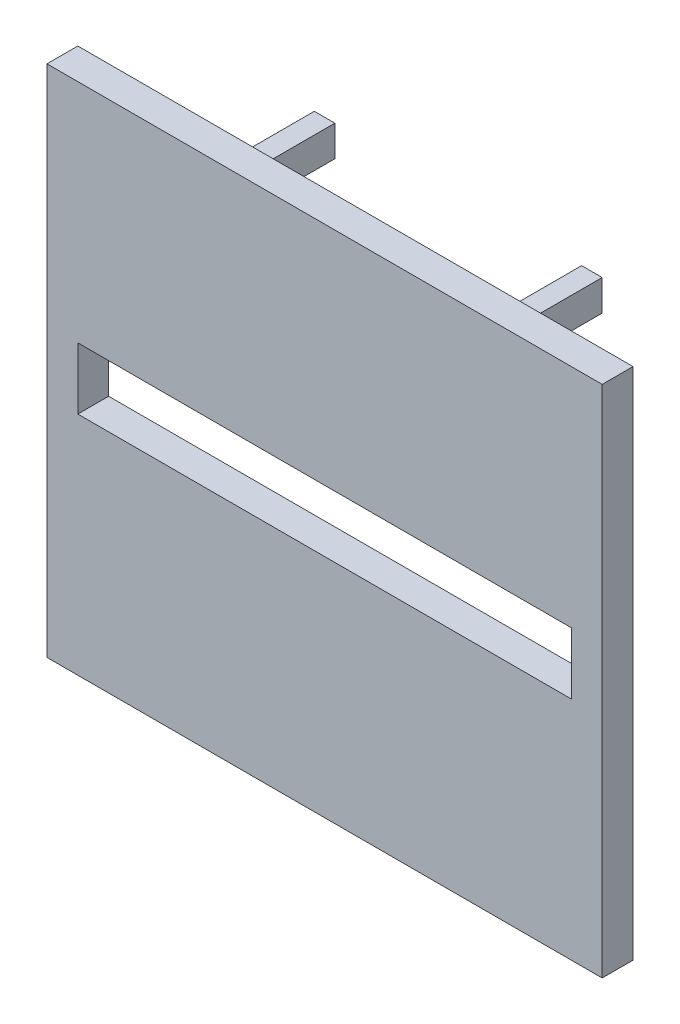
ISO-10303-21;
HEADER;
FILE_DESCRIPTION(('STEP AP214'),'2;1');
FILE_NAME('part.step','',(''),(''),'','','');
FILE_SCHEMA(('AUTOMOTIVE_DESIGN { 1 0 10303 214 1 1 1 1 }'));
ENDSEC;
DATA;
#1=APPLICATION_CONTEXT('core data for automotive mechanical design processes');
#2=APPLICATION_PROTOCOL_DEFINITION('international standard','automotive_design',2000,#1);
#3=PRODUCT_CONTEXT('',#1,'mechanical');
#4=PRODUCT('Part','Part','',(#3));
#5=PRODUCT_RELATED_PRODUCT_CATEGORY('part','',(#4));
#6=PRODUCT_DEFINITION_FORMATION('','',#4);
#7=PRODUCT_DEFINITION_CONTEXT('part definition',#1,'design');
#8=PRODUCT_DEFINITION('design','',#6,#7);
#9=PRODUCT_DEFINITION_SHAPE('','',#8);
#10=(LENGTH_UNIT() NAMED_UNIT(*) SI_UNIT(.MILLI.,.METRE.));
#11=(NAMED_UNIT(*) PLANE_ANGLE_UNIT() SI_UNIT($,.RADIAN.));
#12=(NAMED_UNIT(*) SI_UNIT($,.STERADIAN.) SOLID_ANGLE_UNIT());
#13=UNCERTAINTY_MEASURE_WITH_UNIT(LENGTH_MEASURE(1.E-05),#10,'distance_accuracy_value','');
#14=(GEOMETRIC_REPRESENTATION_CONTEXT(3) GLOBAL_UNCERTAINTY_ASSIGNED_CONTEXT((#13)) GLOBAL_UNIT_ASSIGNED_CONTEXT((#10,
#11,#12)) REPRESENTATION_CONTEXT('',''));
#15=CARTESIAN_POINT('',(0.,0.,0.));
#16=DIRECTION('',(0.,0.,1.));
#17=DIRECTION('',(1.,0.,0.));
#18=AXIS2_PLACEMENT_3D('',#15,#16,#17);
#19=CARTESIAN_POINT('',(0.,0.,0.));
#20=DIRECTION('',(0.,0.,1.));
#21=DIRECTION('',(1.,0.,0.));
#22=AXIS2_PLACEMENT_3D('',#19,#20,#21);
#23=PLANE('',#22);
#24=DIRECTION('',(1.,0.,0.));
#25=VECTOR('',#24,1.);
#26=CARTESIAN_POINT('',(0.,4.,0.));
#27=LINE('',#26,#25);
#28=CARTESIAN_POINT('',(13.,4.,0.));
#29=VERTEX_POINT('',#28);
#30=CARTESIAN_POINT('',(15.,4.,0.));
#31=VERTEX_POINT('',#30);
#32=EDGE_CURVE('E243',#29,#31,#27,.T.);
#33=ORIENTED_EDGE('',*,*,#32,.T.);
#34=DIRECTION('',(0.,1.,0.));
#35=VECTOR('',#34,1.);
#36=CARTESIAN_POINT('',(15.,0.,0.));
#37=LINE('',#36,#35);
#38=CARTESIAN_POINT('',(15.,7.,0.));
#39=VERTEX_POINT('',#38);
#40=EDGE_CURVE('E211',#31,#39,#37,.T.);
#41=ORIENTED_EDGE('',*,*,#40,.T.);
#42=DIRECTION('',(-1.,0.,0.));
#43=VECTOR('',#42,1.);
#44=CARTESIAN_POINT('',(0.,7.,0.));
#45=LINE('',#44,#43);
#46=CARTESIAN_POINT('',(13.,7.,0.));
#47=VERTEX_POINT('',#46);
#48=EDGE_CURVE('E229',#39,#47,#45,.T.);
#49=ORIENTED_EDGE('',*,*,#48,.T.);
#50=DIRECTION('',(0.,-1.,0.));
#51=VECTOR('',#50,1.);
#52=CARTESIAN_POINT('',(13.,0.,0.));
#53=LINE('',#52,#51);
#54=EDGE_CURVE('E59',#47,#29,#53,.T.);
#55=ORIENTED_EDGE('',*,*,#54,.T.);
#56=EDGE_LOOP('',(#33,#41,#49,#55));
#57=FACE_BOUND('',#56,.T.);
#58=DIRECTION('',(0.,1.,0.));
#59=VECTOR('',#58,1.);
#60=CARTESIAN_POINT('',(39.,0.,0.));
#61=LINE('',#60,#59);
#62=CARTESIAN_POINT('',(39.,43.,0.));
#63=VERTEX_POINT('',#62);
#64=CARTESIAN_POINT('',(39.,46.,0.));
#65=VERTEX_POINT('',#64);
#66=EDGE_CURVE('E344',#63,#65,#61,.T.);
#67=ORIENTED_EDGE('',*,*,#66,.F.);
#68=DIRECTION('',(-1.,0.,0.));
#69=VECTOR('',#68,1.);
#70=CARTESIAN_POINT('',(0.,43.,0.));
#71=LINE('',#70,#69);
#72=CARTESIAN_POINT('',(41.,43.,0.));
#73=VERTEX_POINT('',#72);
#74=EDGE_CURVE('E350',#73,#63,#71,.T.);
#75=ORIENTED_EDGE('',*,*,#74,.F.);
#76=DIRECTION('',(0.,1.,0.));
#77=VECTOR('',#76,1.);
#78=CARTESIAN_POINT('',(41.,0.,0.));
#79=LINE('',#78,#77);
#80=CARTESIAN_POINT('',(41.,46.,0.));
#81=VERTEX_POINT('',#80);
#82=EDGE_CURVE('E368',#73,#81,#79,.T.);
#83=ORIENTED_EDGE('',*,*,#82,.T.);
#84=DIRECTION('',(1.,0.,0.));
#85=VECTOR('',#84,1.);
#86=CARTESIAN_POINT('',(0.,46.,0.));
#87=LINE('',#86,#85);
#88=EDGE_CURVE('E364',#65,#81,#87,.T.);
#89=ORIENTED_EDGE('',*,*,#88,.F.);
#90=EDGE_LOOP('',(#67,#75,#83,#89));
#91=FACE_BOUND('',#90,.T.);
#92=DIRECTION('',(0.,-1.,0.));
#93=VECTOR('',#92,1.);
#94=CARTESIAN_POINT('',(0.,50.,0.));
#95=LINE('',#94,#93);
#96=CARTESIAN_POINT('',(0.,50.,0.));
#97=VERTEX_POINT('',#96);
#98=CARTESIAN_POINT('',(0.,0.,0.));
#99=VERTEX_POINT('',#98);
#100=EDGE_CURVE('E432',#97,#99,#95,.T.);
#101=ORIENTED_EDGE('',*,*,#100,.F.);
#102=DIRECTION('',(-1.,0.,0.));
#103=VECTOR('',#102,1.);
#104=CARTESIAN_POINT('',(0.,50.,0.));
#105=LINE('',#104,#103);
#106=CARTESIAN_POINT('',(54.,50.,0.));
#107=VERTEX_POINT('',#106);
#108=EDGE_CURVE('E438',#107,#97,#105,.T.);
#109=ORIENTED_EDGE('',*,*,#108,.F.);
#110=DIRECTION('',(0.,1.,0.));
#111=VECTOR('',#110,1.);
#112=CARTESIAN_POINT('',(54.,50.,0.));
#113=LINE('',#112,#111);
#114=CARTESIAN_POINT('',(54.,0.,0.));
#115=VERTEX_POINT('',#114);
#116=EDGE_CURVE('E454',#115,#107,#113,.T.);
#117=ORIENTED_EDGE('',*,*,#116,.F.);
#118=DIRECTION('',(1.,0.,0.));
#119=VECTOR('',#118,1.);
#120=CARTESIAN_POINT('',(0.,0.,0.));
#121=LINE('',#120,#119);
#122=EDGE_CURVE('E451',#99,#115,#121,.T.);
#123=ORIENTED_EDGE('',*,*,#122,.F.);
#124=EDGE_LOOP('',(#101,#109,#117,#123));
#125=FACE_BOUND('',#124,.T.);
#126=DIRECTION('',(0.,-1.,0.));
#127=VECTOR('',#126,1.);
#128=CARTESIAN_POINT('',(3.,22.,0.));
#129=LINE('',#128,#127);
#130=CARTESIAN_POINT('',(3.,28.,0.));
#131=VERTEX_POINT('',#130);
#132=CARTESIAN_POINT('',(3.,22.,0.));
#133=VERTEX_POINT('',#132);
#134=EDGE_CURVE('E389',#131,#133,#129,.T.);
#135=ORIENTED_EDGE('',*,*,#134,.T.);
#136=DIRECTION('',(1.,0.,0.));
#137=VECTOR('',#136,1.);
#138=CARTESIAN_POINT('',(51.,22.,0.));
#139=LINE('',#138,#137);
#140=CARTESIAN_POINT('',(51.,22.,0.));
#141=VERTEX_POINT('',#140);
#142=EDGE_CURVE('E408',#133,#141,#139,.T.);
#143=ORIENTED_EDGE('',*,*,#142,.T.);
#144=DIRECTION('',(0.,1.,0.));
#145=VECTOR('',#144,1.);
#146=CARTESIAN_POINT('',(51.,28.,0.));
#147=LINE('',#146,#145);
#148=CARTESIAN_POINT('',(51.,28.,0.));
#149=VERTEX_POINT('',#148);
#150=EDGE_CURVE('E412',#141,#149,#147,.T.);
#151=ORIENTED_EDGE('',*,*,#150,.T.);
#152=DIRECTION('',(-1.,0.,0.));
#153=VECTOR('',#152,1.);
#154=CARTESIAN_POINT('',(3.,28.,0.));
#155=LINE('',#154,#153);
#156=EDGE_CURVE('E394',#149,#131,#155,.T.);
#157=ORIENTED_EDGE('',*,*,#156,.T.);
#158=EDGE_LOOP('',(#135,#143,#151,#157));
#159=FACE_BOUND('',#158,.T.);
#160=DIRECTION('',(0.,1.,0.));
#161=VECTOR('',#160,1.);
#162=CARTESIAN_POINT('',(15.,0.,0.));
#163=LINE('',#162,#161);
#164=CARTESIAN_POINT('',(15.,43.,0.));
#165=VERTEX_POINT('',#164);
#166=CARTESIAN_POINT('',(15.,46.,0.));
#167=VERTEX_POINT('',#166);
#168=EDGE_CURVE('E321',#165,#167,#163,.T.);
#169=ORIENTED_EDGE('',*,*,#168,.T.);
#170=DIRECTION('',(-1.,0.,0.));
#171=VECTOR('',#170,1.);
#172=CARTESIAN_POINT('',(0.,46.,0.));
#173=LINE('',#172,#171);
#174=CARTESIAN_POINT('',(13.,46.,0.));
#175=VERTEX_POINT('',#174);
#176=EDGE_CURVE('E299',#167,#175,#173,.T.);
#177=ORIENTED_EDGE('',*,*,#176,.T.);
#178=DIRECTION('',(0.,-1.,0.));
#179=VECTOR('',#178,1.);
#180=CARTESIAN_POINT('',(13.,0.,0.));
#181=LINE('',#180,#179);
#182=CARTESIAN_POINT('',(13.,43.,0.));
#183=VERTEX_POINT('',#182);
#184=EDGE_CURVE('E305',#175,#183,#181,.T.);
#185=ORIENTED_EDGE('',*,*,#184,.T.);
#186=DIRECTION('',(1.,0.,0.));
#187=VECTOR('',#186,1.);
#188=CARTESIAN_POINT('',(0.,43.,0.));
#189=LINE('',#188,#187);
#190=EDGE_CURVE('E325',#183,#165,#189,.T.);
#191=ORIENTED_EDGE('',*,*,#190,.T.);
#192=EDGE_LOOP('',(#169,#177,#185,#191));
#193=FACE_BOUND('',#192,.T.);
#194=DIRECTION('',(-1.,0.,0.));
#195=VECTOR('',#194,1.);
#196=CARTESIAN_POINT('',(0.,4.14123014021213,0.));
#197=LINE('',#196,#195);
#198=CARTESIAN_POINT('',(41.,4.14123014021213,0.));
#199=VERTEX_POINT('',#198);
#200=CARTESIAN_POINT('',(39.1654873742827,4.14123014021213,0.));
#201=VERTEX_POINT('',#200);
#202=EDGE_CURVE('E217',#199,#201,#197,.T.);
#203=ORIENTED_EDGE('',*,*,#202,.F.);
#204=DIRECTION('',(0.,-1.,0.));
#205=VECTOR('',#204,1.);
#206=CARTESIAN_POINT('',(41.,0.,0.));
#207=LINE('',#206,#205);
#208=CARTESIAN_POINT('',(41.,7.,0.));
#209=VERTEX_POINT('',#208);
#210=EDGE_CURVE('E263',#209,#199,#207,.T.);
#211=ORIENTED_EDGE('',*,*,#210,.F.);
#212=DIRECTION('',(1.,0.,0.));
#213=VECTOR('',#212,1.);
#214=CARTESIAN_POINT('',(0.,7.,0.));
#215=LINE('',#214,#213);
#216=CARTESIAN_POINT('',(39.1654873742827,7.,0.));
#217=VERTEX_POINT('',#216);
#218=EDGE_CURVE('E278',#217,#209,#215,.T.);
#219=ORIENTED_EDGE('',*,*,#218,.F.);
#220=DIRECTION('',(0.,1.,0.));
#221=VECTOR('',#220,1.);
#222=CARTESIAN_POINT('',(39.1654873742827,0.,0.));
#223=LINE('',#222,#221);
#224=EDGE_CURVE('E67',#201,#217,#223,.T.);
#225=ORIENTED_EDGE('',*,*,#224,.F.);
#226=EDGE_LOOP('',(#203,#211,#219,#225));
#227=FACE_BOUND('',#226,.T.);
#228=ADVANCED_FACE('F43',(#57,#91,#125,#159,#193,#227),#23,.F.);
#229=CARTESIAN_POINT('',(0.,0.,3.));
#230=DIRECTION('',(0.,0.,1.));
#231=DIRECTION('',(1.,0.,0.));
#232=AXIS2_PLACEMENT_3D('',#229,#230,#231);
#233=PLANE('',#232);
#234=DIRECTION('',(0.,-1.,0.));
#235=VECTOR('',#234,1.);
#236=CARTESIAN_POINT('',(0.,50.,3.));
#237=LINE('',#236,#235);
#238=CARTESIAN_POINT('',(0.,50.,3.));
#239=VERTEX_POINT('',#238);
#240=CARTESIAN_POINT('',(0.,0.,3.));
#241=VERTEX_POINT('',#240);
#242=EDGE_CURVE('E433',#239,#241,#237,.T.);
#243=ORIENTED_EDGE('',*,*,#242,.T.);
#244=DIRECTION('',(1.,0.,0.));
#245=VECTOR('',#244,1.);
#246=CARTESIAN_POINT('',(0.,0.,3.));
#247=LINE('',#246,#245);
#248=CARTESIAN_POINT('',(54.,0.,3.));
#249=VERTEX_POINT('',#248);
#250=EDGE_CURVE('E437',#241,#249,#247,.T.);
#251=ORIENTED_EDGE('',*,*,#250,.T.);
#252=DIRECTION('',(0.,1.,0.));
#253=VECTOR('',#252,1.);
#254=CARTESIAN_POINT('',(54.,50.,3.));
#255=LINE('',#254,#253);
#256=CARTESIAN_POINT('',(54.,50.,3.));
#257=VERTEX_POINT('',#256);
#258=EDGE_CURVE('E441',#249,#257,#255,.T.);
#259=ORIENTED_EDGE('',*,*,#258,.T.);
#260=DIRECTION('',(-1.,0.,0.));
#261=VECTOR('',#260,1.);
#262=CARTESIAN_POINT('',(0.,50.,3.));
#263=LINE('',#262,#261);
#264=EDGE_CURVE('E444',#257,#239,#263,.T.);
#265=ORIENTED_EDGE('',*,*,#264,.T.);
#266=EDGE_LOOP('',(#243,#251,#259,#265));
#267=FACE_BOUND('',#266,.T.);
#268=DIRECTION('',(1.,0.,0.));
#269=VECTOR('',#268,1.);
#270=CARTESIAN_POINT('',(51.,22.,3.));
#271=LINE('',#270,#269);
#272=CARTESIAN_POINT('',(3.,22.,3.));
#273=VERTEX_POINT('',#272);
#274=CARTESIAN_POINT('',(51.,22.,3.));
#275=VERTEX_POINT('',#274);
#276=EDGE_CURVE('E393',#273,#275,#271,.T.);
#277=ORIENTED_EDGE('',*,*,#276,.F.);
#278=DIRECTION('',(0.,-1.,0.));
#279=VECTOR('',#278,1.);
#280=CARTESIAN_POINT('',(3.,22.,3.));
#281=LINE('',#280,#279);
#282=CARTESIAN_POINT('',(3.,28.,3.));
#283=VERTEX_POINT('',#282);
#284=EDGE_CURVE('E390',#283,#273,#281,.T.);
#285=ORIENTED_EDGE('',*,*,#284,.F.);
#286=DIRECTION('',(-1.,0.,0.));
#287=VECTOR('',#286,1.);
#288=CARTESIAN_POINT('',(3.,28.,3.));
#289=LINE('',#288,#287);
#290=CARTESIAN_POINT('',(51.,28.,3.));
#291=VERTEX_POINT('',#290);
#292=EDGE_CURVE('E401',#291,#283,#289,.T.);
#293=ORIENTED_EDGE('',*,*,#292,.F.);
#294=DIRECTION('',(0.,1.,0.));
#295=VECTOR('',#294,1.);
#296=CARTESIAN_POINT('',(51.,28.,3.));
#297=LINE('',#296,#295);
#298=EDGE_CURVE('E397',#275,#291,#297,.T.);
#299=ORIENTED_EDGE('',*,*,#298,.F.);
#300=EDGE_LOOP('',(#277,#285,#293,#299));
#301=FACE_BOUND('',#300,.T.);
#302=ADVANCED_FACE('F486',(#267,#301),#233,.T.);
#303=CARTESIAN_POINT('',(0.,50.,3.));
#304=DIRECTION('',(1.,0.,0.));
#305=DIRECTION('',(0.,1.,0.));
#306=AXIS2_PLACEMENT_3D('',#303,#304,#305);
#307=PLANE('',#306);
#308=ORIENTED_EDGE('',*,*,#100,.T.);
#309=DIRECTION('',(0.,0.,-1.));
#310=VECTOR('',#309,1.);
#311=CARTESIAN_POINT('',(0.,0.,3.));
#312=LINE('',#311,#310);
#313=EDGE_CURVE('E11',#241,#99,#312,.T.);
#314=ORIENTED_EDGE('',*,*,#313,.F.);
#315=ORIENTED_EDGE('',*,*,#242,.F.);
#316=DIRECTION('',(0.,0.,-1.));
#317=VECTOR('',#316,1.);
#318=CARTESIAN_POINT('',(0.,50.,3.));
#319=LINE('',#318,#317);
#320=EDGE_CURVE('E447',#239,#97,#319,.T.);
#321=ORIENTED_EDGE('',*,*,#320,.T.);
#322=EDGE_LOOP('',(#308,#314,#315,#321));
#323=FACE_BOUND('',#322,.T.);
#324=ADVANCED_FACE('F45',(#323),#307,.F.);
#325=CARTESIAN_POINT('',(0.,0.,3.));
#326=DIRECTION('',(0.,1.,0.));
#327=DIRECTION('',(0.,0.,1.));
#328=AXIS2_PLACEMENT_3D('',#325,#326,#327);
#329=PLANE('',#328);
#330=ORIENTED_EDGE('',*,*,#122,.T.);
#331=DIRECTION('',(0.,0.,-1.));
#332=VECTOR('',#331,1.);
#333=CARTESIAN_POINT('',(54.,0.,3.));
#334=LINE('',#333,#332);
#335=EDGE_CURVE('E52',#249,#115,#334,.T.);
#336=ORIENTED_EDGE('',*,*,#335,.F.);
#337=ORIENTED_EDGE('',*,*,#250,.F.);
#338=ORIENTED_EDGE('',*,*,#313,.T.);
#339=EDGE_LOOP('',(#330,#336,#337,#338));
#340=FACE_BOUND('',#339,.T.);
#341=ADVANCED_FACE('F488',(#340),#329,.F.);
#342=CARTESIAN_POINT('',(54.,50.,3.));
#343=DIRECTION('',(-1.,0.,0.));
#344=DIRECTION('',(0.,-1.,0.));
#345=AXIS2_PLACEMENT_3D('',#342,#343,#344);
#346=PLANE('',#345);
#347=ORIENTED_EDGE('',*,*,#116,.T.);
#348=DIRECTION('',(0.,0.,-1.));
#349=VECTOR('',#348,1.);
#350=CARTESIAN_POINT('',(54.,50.,3.));
#351=LINE('',#350,#349);
#352=EDGE_CURVE('E462',#257,#107,#351,.T.);
#353=ORIENTED_EDGE('',*,*,#352,.F.);
#354=ORIENTED_EDGE('',*,*,#258,.F.);
#355=ORIENTED_EDGE('',*,*,#335,.T.);
#356=EDGE_LOOP('',(#347,#353,#354,#355));
#357=FACE_BOUND('',#356,.T.);
#358=ADVANCED_FACE('F471',(#357),#346,.F.);
#359=CARTESIAN_POINT('',(0.,50.,3.));
#360=DIRECTION('',(0.,-1.,0.));
#361=DIRECTION('',(0.,0.,-1.));
#362=AXIS2_PLACEMENT_3D('',#359,#360,#361);
#363=PLANE('',#362);
#364=ORIENTED_EDGE('',*,*,#108,.T.);
#365=ORIENTED_EDGE('',*,*,#320,.F.);
#366=ORIENTED_EDGE('',*,*,#264,.F.);
#367=ORIENTED_EDGE('',*,*,#352,.T.);
#368=EDGE_LOOP('',(#364,#365,#366,#367));
#369=FACE_BOUND('',#368,.T.);
#370=ADVANCED_FACE('F480',(#369),#363,.F.);
#371=CARTESIAN_POINT('',(3.,22.,3.));
#372=DIRECTION('',(1.,0.,0.));
#373=DIRECTION('',(0.,0.,-1.));
#374=AXIS2_PLACEMENT_3D('',#371,#372,#373);
#375=PLANE('',#374);
#376=ORIENTED_EDGE('',*,*,#134,.F.);
#377=DIRECTION('',(0.,0.,-1.));
#378=VECTOR('',#377,1.);
#379=CARTESIAN_POINT('',(3.,28.,3.));
#380=LINE('',#379,#378);
#381=EDGE_CURVE('E404',#283,#131,#380,.T.);
#382=ORIENTED_EDGE('',*,*,#381,.F.);
#383=ORIENTED_EDGE('',*,*,#284,.T.);
#384=DIRECTION('',(0.,0.,-1.));
#385=VECTOR('',#384,1.);
#386=CARTESIAN_POINT('',(3.,22.,3.));
#387=LINE('',#386,#385);
#388=EDGE_CURVE('E428',#273,#133,#387,.T.);
#389=ORIENTED_EDGE('',*,*,#388,.T.);
#390=EDGE_LOOP('',(#376,#382,#383,#389));
#391=FACE_BOUND('',#390,.T.);
#392=ADVANCED_FACE('F506',(#391),#375,.T.);
#393=CARTESIAN_POINT('',(51.,22.,3.));
#394=DIRECTION('',(0.,1.,0.));
#395=DIRECTION('',(0.,0.,1.));
#396=AXIS2_PLACEMENT_3D('',#393,#394,#395);
#397=PLANE('',#396);
#398=ORIENTED_EDGE('',*,*,#142,.F.);
#399=ORIENTED_EDGE('',*,*,#388,.F.);
#400=ORIENTED_EDGE('',*,*,#276,.T.);
#401=DIRECTION('',(0.,0.,-1.));
#402=VECTOR('',#401,1.);
#403=CARTESIAN_POINT('',(51.,22.,3.));
#404=LINE('',#403,#402);
#405=EDGE_CURVE('E425',#275,#141,#404,.T.);
#406=ORIENTED_EDGE('',*,*,#405,.T.);
#407=EDGE_LOOP('',(#398,#399,#400,#406));
#408=FACE_BOUND('',#407,.T.);
#409=ADVANCED_FACE('F510',(#408),#397,.T.);
#410=CARTESIAN_POINT('',(51.,28.,3.));
#411=DIRECTION('',(-1.,0.,0.));
#412=DIRECTION('',(0.,0.,1.));
#413=AXIS2_PLACEMENT_3D('',#410,#411,#412);
#414=PLANE('',#413);
#415=ORIENTED_EDGE('',*,*,#150,.F.);
#416=ORIENTED_EDGE('',*,*,#405,.F.);
#417=ORIENTED_EDGE('',*,*,#298,.T.);
#418=DIRECTION('',(0.,0.,-1.));
#419=VECTOR('',#418,1.);
#420=CARTESIAN_POINT('',(51.,28.,3.));
#421=LINE('',#420,#419);
#422=EDGE_CURVE('E422',#291,#149,#421,.T.);
#423=ORIENTED_EDGE('',*,*,#422,.T.);
#424=EDGE_LOOP('',(#415,#416,#417,#423));
#425=FACE_BOUND('',#424,.T.);
#426=ADVANCED_FACE('F515',(#425),#414,.T.);
#427=CARTESIAN_POINT('',(3.,28.,3.));
#428=DIRECTION('',(0.,-1.,0.));
#429=DIRECTION('',(0.,0.,-1.));
#430=AXIS2_PLACEMENT_3D('',#427,#428,#429);
#431=PLANE('',#430);
#432=ORIENTED_EDGE('',*,*,#156,.F.);
#433=ORIENTED_EDGE('',*,*,#422,.F.);
#434=ORIENTED_EDGE('',*,*,#292,.T.);
#435=ORIENTED_EDGE('',*,*,#381,.T.);
#436=EDGE_LOOP('',(#432,#433,#434,#435));
#437=FACE_BOUND('',#436,.T.);
#438=ADVANCED_FACE('F521',(#437),#431,.T.);
#439=CARTESIAN_POINT('',(39.,0.,-10.));
#440=DIRECTION('',(1.,0.,0.));
#441=DIRECTION('',(0.,0.,-1.));
#442=AXIS2_PLACEMENT_3D('',#439,#440,#441);
#443=PLANE('',#442);
#444=ORIENTED_EDGE('',*,*,#66,.T.);
#445=DIRECTION('',(0.,0.,1.));
#446=VECTOR('',#445,1.);
#447=CARTESIAN_POINT('',(39.,46.,-10.));
#448=LINE('',#447,#446);
#449=CARTESIAN_POINT('',(39.,46.,-10.));
#450=VERTEX_POINT('',#449);
#451=EDGE_CURVE('E385',#450,#65,#448,.T.);
#452=ORIENTED_EDGE('',*,*,#451,.F.);
#453=DIRECTION('',(0.,1.,0.));
#454=VECTOR('',#453,1.);
#455=CARTESIAN_POINT('',(39.,0.,-10.));
#456=LINE('',#455,#454);
#457=CARTESIAN_POINT('',(39.,43.,-10.));
#458=VERTEX_POINT('',#457);
#459=EDGE_CURVE('E345',#458,#450,#456,.T.);
#460=ORIENTED_EDGE('',*,*,#459,.F.);
#461=DIRECTION('',(0.,0.,1.));
#462=VECTOR('',#461,1.);
#463=CARTESIAN_POINT('',(39.,43.,-10.));
#464=LINE('',#463,#462);
#465=EDGE_CURVE('E360',#458,#63,#464,.T.);
#466=ORIENTED_EDGE('',*,*,#465,.T.);
#467=EDGE_LOOP('',(#444,#452,#460,#466));
#468=FACE_BOUND('',#467,.T.);
#469=ADVANCED_FACE('F525',(#468),#443,.F.);
#470=CARTESIAN_POINT('',(0.,46.,-10.));
#471=DIRECTION('',(0.,-1.,0.));
#472=DIRECTION('',(0.,0.,-1.));
#473=AXIS2_PLACEMENT_3D('',#470,#471,#472);
#474=PLANE('',#473);
#475=ORIENTED_EDGE('',*,*,#88,.T.);
#476=DIRECTION('',(0.,0.,1.));
#477=VECTOR('',#476,1.);
#478=CARTESIAN_POINT('',(41.,46.,-10.));
#479=LINE('',#478,#477);
#480=CARTESIAN_POINT('',(41.,46.,-10.));
#481=VERTEX_POINT('',#480);
#482=EDGE_CURVE('E381',#481,#81,#479,.T.);
#483=ORIENTED_EDGE('',*,*,#482,.F.);
#484=DIRECTION('',(1.,0.,0.));
#485=VECTOR('',#484,1.);
#486=CARTESIAN_POINT('',(0.,46.,-10.));
#487=LINE('',#486,#485);
#488=EDGE_CURVE('E349',#450,#481,#487,.T.);
#489=ORIENTED_EDGE('',*,*,#488,.F.);
#490=ORIENTED_EDGE('',*,*,#451,.T.);
#491=EDGE_LOOP('',(#475,#483,#489,#490));
#492=FACE_BOUND('',#491,.T.);
#493=ADVANCED_FACE('F529',(#492),#474,.F.);
#494=CARTESIAN_POINT('',(41.,0.,-10.));
#495=DIRECTION('',(1.,0.,0.));
#496=DIRECTION('',(0.,1.,0.));
#497=AXIS2_PLACEMENT_3D('',#494,#495,#496);
#498=PLANE('',#497);
#499=ORIENTED_EDGE('',*,*,#82,.F.);
#500=DIRECTION('',(0.,0.,1.));
#501=VECTOR('',#500,1.);
#502=CARTESIAN_POINT('',(41.,43.,-10.));
#503=LINE('',#502,#501);
#504=CARTESIAN_POINT('',(41.,43.,-10.));
#505=VERTEX_POINT('',#504);
#506=EDGE_CURVE('E377',#505,#73,#503,.T.);
#507=ORIENTED_EDGE('',*,*,#506,.F.);
#508=DIRECTION('',(0.,1.,0.));
#509=VECTOR('',#508,1.);
#510=CARTESIAN_POINT('',(41.,0.,-10.));
#511=LINE('',#510,#509);
#512=EDGE_CURVE('E353',#505,#481,#511,.T.);
#513=ORIENTED_EDGE('',*,*,#512,.T.);
#514=ORIENTED_EDGE('',*,*,#482,.T.);
#515=EDGE_LOOP('',(#499,#507,#513,#514));
#516=FACE_BOUND('',#515,.T.);
#517=ADVANCED_FACE('F533',(#516),#498,.T.);
#518=CARTESIAN_POINT('',(0.,43.,-10.));
#519=DIRECTION('',(0.,1.,0.));
#520=DIRECTION('',(0.,0.,1.));
#521=AXIS2_PLACEMENT_3D('',#518,#519,#520);
#522=PLANE('',#521);
#523=ORIENTED_EDGE('',*,*,#74,.T.);
#524=ORIENTED_EDGE('',*,*,#465,.F.);
#525=DIRECTION('',(-1.,0.,0.));
#526=VECTOR('',#525,1.);
#527=CARTESIAN_POINT('',(0.,43.,-10.));
#528=LINE('',#527,#526);
#529=EDGE_CURVE('E357',#505,#458,#528,.T.);
#530=ORIENTED_EDGE('',*,*,#529,.F.);
#531=ORIENTED_EDGE('',*,*,#506,.T.);
#532=EDGE_LOOP('',(#523,#524,#530,#531));
#533=FACE_BOUND('',#532,.T.);
#534=ADVANCED_FACE('F537',(#533),#522,.F.);
#535=CARTESIAN_POINT('',(0.,0.,-10.));
#536=DIRECTION('',(0.,0.,-1.));
#537=DIRECTION('',(-1.,0.,0.));
#538=AXIS2_PLACEMENT_3D('',#535,#536,#537);
#539=PLANE('',#538);
#540=ORIENTED_EDGE('',*,*,#459,.T.);
#541=ORIENTED_EDGE('',*,*,#488,.T.);
#542=ORIENTED_EDGE('',*,*,#512,.F.);
#543=ORIENTED_EDGE('',*,*,#529,.T.);
#544=EDGE_LOOP('',(#540,#541,#542,#543));
#545=FACE_BOUND('',#544,.T.);
#546=ADVANCED_FACE('F541',(#545),#539,.T.);
#547=CARTESIAN_POINT('',(0.,46.,-10.));
#548=DIRECTION('',(0.,1.,0.));
#549=DIRECTION('',(0.,0.,1.));
#550=AXIS2_PLACEMENT_3D('',#547,#548,#549);
#551=PLANE('',#550);
#552=ORIENTED_EDGE('',*,*,#176,.F.);
#553=DIRECTION('',(0.,0.,1.));
#554=VECTOR('',#553,1.);
#555=CARTESIAN_POINT('',(15.,46.,-10.));
#556=LINE('',#555,#554);
#557=CARTESIAN_POINT('',(15.,46.,-10.));
#558=VERTEX_POINT('',#557);
#559=EDGE_CURVE('E341',#558,#167,#556,.T.);
#560=ORIENTED_EDGE('',*,*,#559,.F.);
#561=DIRECTION('',(-1.,0.,0.));
#562=VECTOR('',#561,1.);
#563=CARTESIAN_POINT('',(0.,46.,-10.));
#564=LINE('',#563,#562);
#565=CARTESIAN_POINT('',(13.,46.,-10.));
#566=VERTEX_POINT('',#565);
#567=EDGE_CURVE('E300',#558,#566,#564,.T.);
#568=ORIENTED_EDGE('',*,*,#567,.T.);
#569=DIRECTION('',(0.,0.,1.));
#570=VECTOR('',#569,1.);
#571=CARTESIAN_POINT('',(13.,46.,-10.));
#572=LINE('',#571,#570);
#573=EDGE_CURVE('E317',#566,#175,#572,.T.);
#574=ORIENTED_EDGE('',*,*,#573,.T.);
#575=EDGE_LOOP('',(#552,#560,#568,#574));
#576=FACE_BOUND('',#575,.T.);
#577=ADVANCED_FACE('F545',(#576),#551,.T.);
#578=CARTESIAN_POINT('',(15.,0.,-10.));
#579=DIRECTION('',(1.,0.,0.));
#580=DIRECTION('',(0.,1.,0.));
#581=AXIS2_PLACEMENT_3D('',#578,#579,#580);
#582=PLANE('',#581);
#583=ORIENTED_EDGE('',*,*,#168,.F.);
#584=DIRECTION('',(0.,0.,1.));
#585=VECTOR('',#584,1.);
#586=CARTESIAN_POINT('',(15.,43.,-10.));
#587=LINE('',#586,#585);
#588=CARTESIAN_POINT('',(15.,43.,-10.));
#589=VERTEX_POINT('',#588);
#590=EDGE_CURVE('E338',#589,#165,#587,.T.);
#591=ORIENTED_EDGE('',*,*,#590,.F.);
#592=DIRECTION('',(0.,1.,0.));
#593=VECTOR('',#592,1.);
#594=CARTESIAN_POINT('',(15.,0.,-10.));
#595=LINE('',#594,#593);
#596=EDGE_CURVE('E304',#589,#558,#595,.T.);
#597=ORIENTED_EDGE('',*,*,#596,.T.);
#598=ORIENTED_EDGE('',*,*,#559,.T.);
#599=EDGE_LOOP('',(#583,#591,#597,#598));
#600=FACE_BOUND('',#599,.T.);
#601=ADVANCED_FACE('F549',(#600),#582,.T.);
#602=CARTESIAN_POINT('',(0.,43.,-10.));
#603=DIRECTION('',(0.,-1.,0.));
#604=DIRECTION('',(0.,0.,-1.));
#605=AXIS2_PLACEMENT_3D('',#602,#603,#604);
#606=PLANE('',#605);
#607=ORIENTED_EDGE('',*,*,#190,.F.);
#608=DIRECTION('',(0.,0.,1.));
#609=VECTOR('',#608,1.);
#610=CARTESIAN_POINT('',(13.,43.,-10.));
#611=LINE('',#610,#609);
#612=CARTESIAN_POINT('',(13.,43.,-10.));
#613=VERTEX_POINT('',#612);
#614=EDGE_CURVE('E334',#613,#183,#611,.T.);
#615=ORIENTED_EDGE('',*,*,#614,.F.);
#616=DIRECTION('',(1.,0.,0.));
#617=VECTOR('',#616,1.);
#618=CARTESIAN_POINT('',(0.,43.,-10.));
#619=LINE('',#618,#617);
#620=EDGE_CURVE('E309',#613,#589,#619,.T.);
#621=ORIENTED_EDGE('',*,*,#620,.T.);
#622=ORIENTED_EDGE('',*,*,#590,.T.);
#623=EDGE_LOOP('',(#607,#615,#621,#622));
#624=FACE_BOUND('',#623,.T.);
#625=ADVANCED_FACE('F553',(#624),#606,.T.);
#626=CARTESIAN_POINT('',(13.,0.,-10.));
#627=DIRECTION('',(-1.,0.,0.));
#628=DIRECTION('',(0.,0.,1.));
#629=AXIS2_PLACEMENT_3D('',#626,#627,#628);
#630=PLANE('',#629);
#631=ORIENTED_EDGE('',*,*,#184,.F.);
#632=ORIENTED_EDGE('',*,*,#573,.F.);
#633=DIRECTION('',(0.,-1.,0.));
#634=VECTOR('',#633,1.);
#635=CARTESIAN_POINT('',(13.,0.,-10.));
#636=LINE('',#635,#634);
#637=EDGE_CURVE('E313',#566,#613,#636,.T.);
#638=ORIENTED_EDGE('',*,*,#637,.T.);
#639=ORIENTED_EDGE('',*,*,#614,.T.);
#640=EDGE_LOOP('',(#631,#632,#638,#639));
#641=FACE_BOUND('',#640,.T.);
#642=ADVANCED_FACE('F557',(#641),#630,.T.);
#643=CARTESIAN_POINT('',(0.,0.,-10.));
#644=DIRECTION('',(0.,0.,-1.));
#645=DIRECTION('',(-1.,0.,0.));
#646=AXIS2_PLACEMENT_3D('',#643,#644,#645);
#647=PLANE('',#646);
#648=ORIENTED_EDGE('',*,*,#567,.F.);
#649=ORIENTED_EDGE('',*,*,#596,.F.);
#650=ORIENTED_EDGE('',*,*,#620,.F.);
#651=ORIENTED_EDGE('',*,*,#637,.F.);
#652=EDGE_LOOP('',(#648,#649,#650,#651));
#653=FACE_BOUND('',#652,.T.);
#654=ADVANCED_FACE('F561',(#653),#647,.T.);
#655=CARTESIAN_POINT('',(0.,4.14123014021213,-10.));
#656=DIRECTION('',(0.,1.,0.));
#657=DIRECTION('',(0.,0.,1.));
#658=AXIS2_PLACEMENT_3D('',#655,#656,#657);
#659=PLANE('',#658);
#660=ORIENTED_EDGE('',*,*,#202,.T.);
#661=DIRECTION('',(0.,0.,1.));
#662=VECTOR('',#661,1.);
#663=CARTESIAN_POINT('',(39.1654873742827,4.14123014021213,-10.));
#664=LINE('',#663,#662);
#665=CARTESIAN_POINT('',(39.1654873742827,4.14123014021213,-10.));
#666=VERTEX_POINT('',#665);
#667=EDGE_CURVE('E296',#666,#201,#664,.T.);
#668=ORIENTED_EDGE('',*,*,#667,.F.);
#669=DIRECTION('',(-1.,0.,0.));
#670=VECTOR('',#669,1.);
#671=CARTESIAN_POINT('',(0.,4.14123014021213,-10.));
#672=LINE('',#671,#670);
#673=CARTESIAN_POINT('',(41.,4.14123014021213,-10.));
#674=VERTEX_POINT('',#673);
#675=EDGE_CURVE('E258',#674,#666,#672,.T.);
#676=ORIENTED_EDGE('',*,*,#675,.F.);
#677=DIRECTION('',(0.,0.,1.));
#678=VECTOR('',#677,1.);
#679=CARTESIAN_POINT('',(41.,4.14123014021213,-10.));
#680=LINE('',#679,#678);
#681=EDGE_CURVE('E272',#674,#199,#680,.T.);
#682=ORIENTED_EDGE('',*,*,#681,.T.);
#683=EDGE_LOOP('',(#660,#668,#676,#682));
#684=FACE_BOUND('',#683,.T.);
#685=ADVANCED_FACE('F565',(#684),#659,.F.);
#686=CARTESIAN_POINT('',(39.1654873742827,0.,-10.));
#687=DIRECTION('',(1.,0.,0.));
#688=DIRECTION('',(0.,0.,-1.));
#689=AXIS2_PLACEMENT_3D('',#686,#687,#688);
#690=PLANE('',#689);
#691=ORIENTED_EDGE('',*,*,#224,.T.);
#692=DIRECTION('',(0.,0.,1.));
#693=VECTOR('',#692,1.);
#694=CARTESIAN_POINT('',(39.1654873742827,7.,-10.));
#695=LINE('',#694,#693);
#696=CARTESIAN_POINT('',(39.1654873742827,7.,-10.));
#697=VERTEX_POINT('',#696);
#698=EDGE_CURVE('E292',#697,#217,#695,.T.);
#699=ORIENTED_EDGE('',*,*,#698,.F.);
#700=DIRECTION('',(0.,1.,0.));
#701=VECTOR('',#700,1.);
#702=CARTESIAN_POINT('',(39.1654873742827,0.,-10.));
#703=LINE('',#702,#701);
#704=EDGE_CURVE('E262',#666,#697,#703,.T.);
#705=ORIENTED_EDGE('',*,*,#704,.F.);
#706=ORIENTED_EDGE('',*,*,#667,.T.);
#707=EDGE_LOOP('',(#691,#699,#705,#706));
#708=FACE_BOUND('',#707,.T.);
#709=ADVANCED_FACE('F569',(#708),#690,.F.);
#710=CARTESIAN_POINT('',(0.,7.,-10.));
#711=DIRECTION('',(0.,-1.,0.));
#712=DIRECTION('',(0.,0.,-1.));
#713=AXIS2_PLACEMENT_3D('',#710,#711,#712);
#714=PLANE('',#713);
#715=ORIENTED_EDGE('',*,*,#218,.T.);
#716=DIRECTION('',(0.,0.,1.));
#717=VECTOR('',#716,1.);
#718=CARTESIAN_POINT('',(41.,7.,-10.));
#719=LINE('',#718,#717);
#720=CARTESIAN_POINT('',(41.,7.,-10.));
#721=VERTEX_POINT('',#720);
#722=EDGE_CURVE('E288',#721,#209,#719,.T.);
#723=ORIENTED_EDGE('',*,*,#722,.F.);
#724=DIRECTION('',(1.,0.,0.));
#725=VECTOR('',#724,1.);
#726=CARTESIAN_POINT('',(0.,7.,-10.));
#727=LINE('',#726,#725);
#728=EDGE_CURVE('E266',#697,#721,#727,.T.);
#729=ORIENTED_EDGE('',*,*,#728,.F.);
#730=ORIENTED_EDGE('',*,*,#698,.T.);
#731=EDGE_LOOP('',(#715,#723,#729,#730));
#732=FACE_BOUND('',#731,.T.);
#733=ADVANCED_FACE('F573',(#732),#714,.F.);
#734=CARTESIAN_POINT('',(41.,0.,-10.));
#735=DIRECTION('',(-1.,0.,0.));
#736=DIRECTION('',(0.,0.,1.));
#737=AXIS2_PLACEMENT_3D('',#734,#735,#736);
#738=PLANE('',#737);
#739=ORIENTED_EDGE('',*,*,#210,.T.);
#740=ORIENTED_EDGE('',*,*,#681,.F.);
#741=DIRECTION('',(0.,-1.,0.));
#742=VECTOR('',#741,1.);
#743=CARTESIAN_POINT('',(41.,0.,-10.));
#744=LINE('',#743,#742);
#745=EDGE_CURVE('E269',#721,#674,#744,.T.);
#746=ORIENTED_EDGE('',*,*,#745,.F.);
#747=ORIENTED_EDGE('',*,*,#722,.T.);
#748=EDGE_LOOP('',(#739,#740,#746,#747));
#749=FACE_BOUND('',#748,.T.);
#750=ADVANCED_FACE('F577',(#749),#738,.F.);
#751=CARTESIAN_POINT('',(0.,0.,-10.));
#752=DIRECTION('',(0.,0.,-1.));
#753=DIRECTION('',(-1.,0.,0.));
#754=AXIS2_PLACEMENT_3D('',#751,#752,#753);
#755=PLANE('',#754);
#756=ORIENTED_EDGE('',*,*,#675,.T.);
#757=ORIENTED_EDGE('',*,*,#704,.T.);
#758=ORIENTED_EDGE('',*,*,#728,.T.);
#759=ORIENTED_EDGE('',*,*,#745,.T.);
#760=EDGE_LOOP('',(#756,#757,#758,#759));
#761=FACE_BOUND('',#760,.T.);
#762=ADVANCED_FACE('F581',(#761),#755,.T.);
#763=CARTESIAN_POINT('',(15.,0.,-10.));
#764=DIRECTION('',(1.,0.,0.));
#765=DIRECTION('',(0.,0.,-1.));
#766=AXIS2_PLACEMENT_3D('',#763,#764,#765);
#767=PLANE('',#766);
#768=ORIENTED_EDGE('',*,*,#40,.F.);
#769=DIRECTION('',(0.,0.,1.));
#770=VECTOR('',#769,1.);
#771=CARTESIAN_POINT('',(15.,4.,-10.));
#772=LINE('',#771,#770);
#773=CARTESIAN_POINT('',(15.,4.,-10.));
#774=VERTEX_POINT('',#773);
#775=EDGE_CURVE('E205',#774,#31,#772,.T.);
#776=ORIENTED_EDGE('',*,*,#775,.F.);
#777=DIRECTION('',(0.,1.,0.));
#778=VECTOR('',#777,1.);
#779=CARTESIAN_POINT('',(15.,0.,-10.));
#780=LINE('',#779,#778);
#781=CARTESIAN_POINT('',(15.,7.,-10.));
#782=VERTEX_POINT('',#781);
#783=EDGE_CURVE('E208',#774,#782,#780,.T.);
#784=ORIENTED_EDGE('',*,*,#783,.T.);
#785=DIRECTION('',(0.,0.,1.));
#786=VECTOR('',#785,1.);
#787=CARTESIAN_POINT('',(15.,7.,-10.));
#788=LINE('',#787,#786);
#789=EDGE_CURVE('E240',#782,#39,#788,.T.);
#790=ORIENTED_EDGE('',*,*,#789,.T.);
#791=EDGE_LOOP('',(#768,#776,#784,#790));
#792=FACE_BOUND('',#791,.T.);
#793=ADVANCED_FACE('F207',(#792),#767,.T.);
#794=CARTESIAN_POINT('',(0.,4.,-10.));
#795=DIRECTION('',(0.,-1.,0.));
#796=DIRECTION('',(0.,0.,-1.));
#797=AXIS2_PLACEMENT_3D('',#794,#795,#796);
#798=PLANE('',#797);
#799=ORIENTED_EDGE('',*,*,#32,.F.);
#800=DIRECTION('',(0.,0.,1.));
#801=VECTOR('',#800,1.);
#802=CARTESIAN_POINT('',(13.,4.,-10.));
#803=LINE('',#802,#801);
#804=CARTESIAN_POINT('',(13.,4.,-10.));
#805=VERTEX_POINT('',#804);
#806=EDGE_CURVE('E218',#805,#29,#803,.T.);
#807=ORIENTED_EDGE('',*,*,#806,.F.);
#808=DIRECTION('',(1.,0.,0.));
#809=VECTOR('',#808,1.);
#810=CARTESIAN_POINT('',(0.,4.,-10.));
#811=LINE('',#810,#809);
#812=EDGE_CURVE('E224',#805,#774,#811,.T.);
#813=ORIENTED_EDGE('',*,*,#812,.T.);
#814=ORIENTED_EDGE('',*,*,#775,.T.);
#815=EDGE_LOOP('',(#799,#807,#813,#814));
#816=FACE_BOUND('',#815,.T.);
#817=ADVANCED_FACE('F231',(#816),#798,.T.);
#818=CARTESIAN_POINT('',(13.,0.,-10.));
#819=DIRECTION('',(-1.,0.,0.));
#820=DIRECTION('',(0.,-1.,0.));
#821=AXIS2_PLACEMENT_3D('',#818,#819,#820);
#822=PLANE('',#821);
#823=ORIENTED_EDGE('',*,*,#54,.F.);
#824=DIRECTION('',(0.,0.,1.));
#825=VECTOR('',#824,1.);
#826=CARTESIAN_POINT('',(13.,7.,-10.));
#827=LINE('',#826,#825);
#828=CARTESIAN_POINT('',(13.,7.,-10.));
#829=VERTEX_POINT('',#828);
#830=EDGE_CURVE('E253',#829,#47,#827,.T.);
#831=ORIENTED_EDGE('',*,*,#830,.F.);
#832=DIRECTION('',(0.,-1.,0.));
#833=VECTOR('',#832,1.);
#834=CARTESIAN_POINT('',(13.,0.,-10.));
#835=LINE('',#834,#833);
#836=EDGE_CURVE('E233',#829,#805,#835,.T.);
#837=ORIENTED_EDGE('',*,*,#836,.T.);
#838=ORIENTED_EDGE('',*,*,#806,.T.);
#839=EDGE_LOOP('',(#823,#831,#837,#838));
#840=FACE_BOUND('',#839,.T.);
#841=ADVANCED_FACE('F590',(#840),#822,.T.);
#842=CARTESIAN_POINT('',(0.,7.,-10.));
#843=DIRECTION('',(0.,1.,0.));
#844=DIRECTION('',(0.,0.,1.));
#845=AXIS2_PLACEMENT_3D('',#842,#843,#844);
#846=PLANE('',#845);
#847=ORIENTED_EDGE('',*,*,#48,.F.);
#848=ORIENTED_EDGE('',*,*,#789,.F.);
#849=DIRECTION('',(-1.,0.,0.));
#850=VECTOR('',#849,1.);
#851=CARTESIAN_POINT('',(0.,7.,-10.));
#852=LINE('',#851,#850);
#853=EDGE_CURVE('E227',#782,#829,#852,.T.);
#854=ORIENTED_EDGE('',*,*,#853,.T.);
#855=ORIENTED_EDGE('',*,*,#830,.T.);
#856=EDGE_LOOP('',(#847,#848,#854,#855));
#857=FACE_BOUND('',#856,.T.);
#858=ADVANCED_FACE('F593',(#857),#846,.T.);
#859=CARTESIAN_POINT('',(0.,0.,-10.));
#860=DIRECTION('',(0.,0.,-1.));
#861=DIRECTION('',(-1.,0.,0.));
#862=AXIS2_PLACEMENT_3D('',#859,#860,#861);
#863=PLANE('',#862);
#864=ORIENTED_EDGE('',*,*,#783,.F.);
#865=ORIENTED_EDGE('',*,*,#812,.F.);
#866=ORIENTED_EDGE('',*,*,#836,.F.);
#867=ORIENTED_EDGE('',*,*,#853,.F.);
#868=EDGE_LOOP('',(#864,#865,#866,#867));
#869=FACE_BOUND('',#868,.T.);
#870=ADVANCED_FACE('F222',(#869),#863,.T.);
#871=CLOSED_SHELL('',(#228,#302,#324,#341,#358,#370,#392,#409,#426,#438,#469,#493,#517,#534,
#546,#577,#601,#625,#642,#654,#685,#709,#733,#750,#762,#793,#817,#841,#858,#870));
#872=MANIFOLD_SOLID_BREP('B2',#871);
#873=ADVANCED_BREP_SHAPE_REPRESENTATION('',(#18,#872),#14);
#874=SHAPE_DEFINITION_REPRESENTATION(#9,#873);
ENDSEC;
END-ISO-10303-21;
